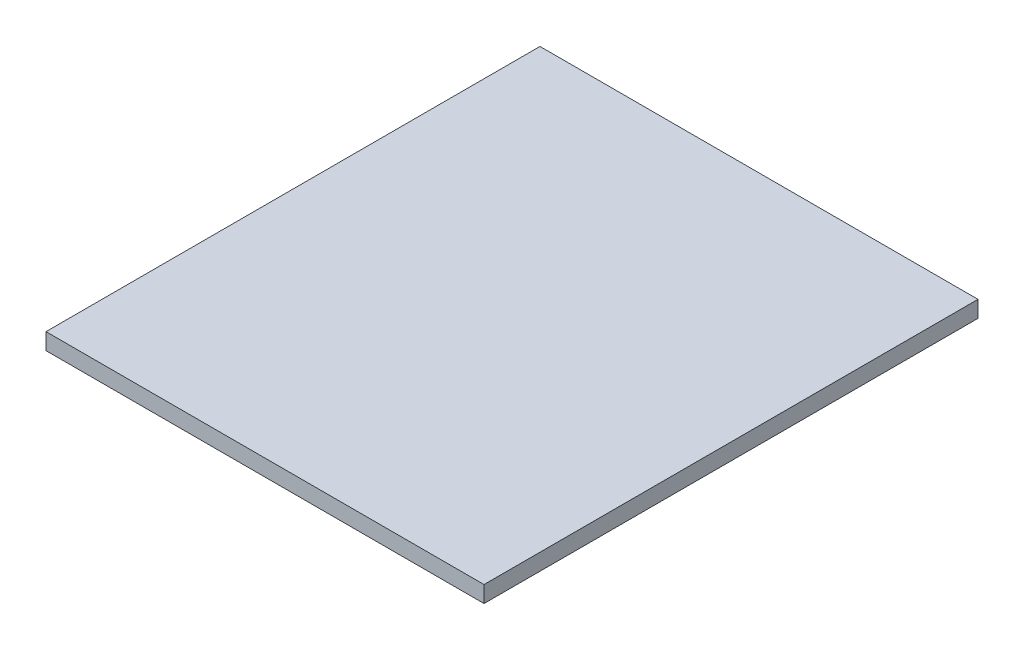
ISO-10303-21;
HEADER;
FILE_DESCRIPTION(('STEP AP214'),'2;1');
FILE_NAME('part.step','',(''),(''),'','','');
FILE_SCHEMA(('AUTOMOTIVE_DESIGN { 1 0 10303 214 1 1 1 1 }'));
ENDSEC;
DATA;
#1=APPLICATION_CONTEXT('core data for automotive mechanical design processes');
#2=APPLICATION_PROTOCOL_DEFINITION('international standard','automotive_design',2000,#1);
#3=PRODUCT_CONTEXT('',#1,'mechanical');
#4=PRODUCT('Part','Part','',(#3));
#5=PRODUCT_RELATED_PRODUCT_CATEGORY('part','',(#4));
#6=PRODUCT_DEFINITION_FORMATION('','',#4);
#7=PRODUCT_DEFINITION_CONTEXT('part definition',#1,'design');
#8=PRODUCT_DEFINITION('design','',#6,#7);
#9=PRODUCT_DEFINITION_SHAPE('','',#8);
#10=(LENGTH_UNIT() NAMED_UNIT(*) SI_UNIT(.MILLI.,.METRE.));
#11=(NAMED_UNIT(*) PLANE_ANGLE_UNIT() SI_UNIT($,.RADIAN.));
#12=(NAMED_UNIT(*) SI_UNIT($,.STERADIAN.) SOLID_ANGLE_UNIT());
#13=UNCERTAINTY_MEASURE_WITH_UNIT(LENGTH_MEASURE(1.E-05),#10,'distance_accuracy_value','');
#14=(GEOMETRIC_REPRESENTATION_CONTEXT(3) GLOBAL_UNCERTAINTY_ASSIGNED_CONTEXT((#13)) GLOBAL_UNIT_ASSIGNED_CONTEXT((#10,
#11,#12)) REPRESENTATION_CONTEXT('',''));
#15=CARTESIAN_POINT('',(0.,0.,0.));
#16=DIRECTION('',(0.,0.,1.));
#17=DIRECTION('',(1.,0.,0.));
#18=AXIS2_PLACEMENT_3D('',#15,#16,#17);
#19=CARTESIAN_POINT('',(-32.7919519710409,-2.80601026846749,-18.8397303234904));
#20=DIRECTION('',(-1.,0.,0.));
#21=DIRECTION('',(0.,0.,1.));
#22=AXIS2_PLACEMENT_3D('',#19,#20,#21);
#23=PLANE('',#22);
#24=DIRECTION('',(0.,1.,0.));
#25=VECTOR('',#24,1.);
#26=CARTESIAN_POINT('',(-32.7919519710409,-2.80601026846749,82.9682858626128));
#27=LINE('',#26,#25);
#28=CARTESIAN_POINT('',(-32.7919519710409,-2.80601026846749,82.9682858626128));
#29=VERTEX_POINT('',#28);
#30=CARTESIAN_POINT('',(-32.7919519710409,0.591745503008931,82.9682858626128));
#31=VERTEX_POINT('',#30);
#32=EDGE_CURVE('E40',#29,#31,#27,.T.);
#33=ORIENTED_EDGE('',*,*,#32,.T.);
#34=DIRECTION('',(0.,0.,1.));
#35=VECTOR('',#34,1.);
#36=CARTESIAN_POINT('',(-32.7919519710409,0.591745503008931,-18.8397303234904));
#37=LINE('',#36,#35);
#38=CARTESIAN_POINT('',(-32.7919519710409,0.591745503008931,-18.8397303234904));
#39=VERTEX_POINT('',#38);
#40=EDGE_CURVE('E77',#39,#31,#37,.T.);
#41=ORIENTED_EDGE('',*,*,#40,.F.);
#42=DIRECTION('',(0.,1.,0.));
#43=VECTOR('',#42,1.);
#44=CARTESIAN_POINT('',(-32.7919519710409,-2.80601026846749,-18.8397303234904));
#45=LINE('',#44,#43);
#46=CARTESIAN_POINT('',(-32.7919519710409,-2.80601026846749,-18.8397303234904));
#47=VERTEX_POINT('',#46);
#48=EDGE_CURVE('E11',#47,#39,#45,.T.);
#49=ORIENTED_EDGE('',*,*,#48,.F.);
#50=DIRECTION('',(0.,0.,1.));
#51=VECTOR('',#50,1.);
#52=CARTESIAN_POINT('',(-32.7919519710409,-2.80601026846749,-18.8397303234904));
#53=LINE('',#52,#51);
#54=EDGE_CURVE('E78',#47,#29,#53,.T.);
#55=ORIENTED_EDGE('',*,*,#54,.T.);
#56=EDGE_LOOP('',(#33,#41,#49,#55));
#57=FACE_BOUND('',#56,.T.);
#58=ADVANCED_FACE('F37',(#57),#23,.T.);
#59=CARTESIAN_POINT('',(-32.7919519710409,-2.80601026846749,-18.8397303234904));
#60=DIRECTION('',(0.,0.,-1.));
#61=DIRECTION('',(-1.,0.,0.));
#62=AXIS2_PLACEMENT_3D('',#59,#60,#61);
#63=PLANE('',#62);
#64=ORIENTED_EDGE('',*,*,#48,.T.);
#65=DIRECTION('',(-1.,0.,0.));
#66=VECTOR('',#65,1.);
#67=CARTESIAN_POINT('',(-32.7919519710409,0.591745503008931,-18.8397303234904));
#68=LINE('',#67,#66);
#69=CARTESIAN_POINT('',(57.4859173132641,0.591745503008931,-18.8397303234904));
#70=VERTEX_POINT('',#69);
#71=EDGE_CURVE('E94',#70,#39,#68,.T.);
#72=ORIENTED_EDGE('',*,*,#71,.F.);
#73=DIRECTION('',(0.,1.,0.));
#74=VECTOR('',#73,1.);
#75=CARTESIAN_POINT('',(57.4859173132641,-2.80601026846749,-18.8397303234904));
#76=LINE('',#75,#74);
#77=CARTESIAN_POINT('',(57.4859173132641,-2.80601026846749,-18.8397303234904));
#78=VERTEX_POINT('',#77);
#79=EDGE_CURVE('E45',#78,#70,#76,.T.);
#80=ORIENTED_EDGE('',*,*,#79,.F.);
#81=DIRECTION('',(-1.,0.,0.));
#82=VECTOR('',#81,1.);
#83=CARTESIAN_POINT('',(-32.7919519710409,-2.80601026846749,-18.8397303234904));
#84=LINE('',#83,#82);
#85=EDGE_CURVE('E83',#78,#47,#84,.T.);
#86=ORIENTED_EDGE('',*,*,#85,.T.);
#87=EDGE_LOOP('',(#64,#72,#80,#86));
#88=FACE_BOUND('',#87,.T.);
#89=ADVANCED_FACE('F109',(#88),#63,.T.);
#90=CARTESIAN_POINT('',(57.4859173132641,-2.80601026846749,-18.8397303234904));
#91=DIRECTION('',(1.,0.,0.));
#92=DIRECTION('',(0.,0.,-1.));
#93=AXIS2_PLACEMENT_3D('',#90,#91,#92);
#94=PLANE('',#93);
#95=ORIENTED_EDGE('',*,*,#79,.T.);
#96=DIRECTION('',(0.,0.,-1.));
#97=VECTOR('',#96,1.);
#98=CARTESIAN_POINT('',(57.4859173132641,0.591745503008931,-18.8397303234904));
#99=LINE('',#98,#97);
#100=CARTESIAN_POINT('',(57.4859173132641,0.591745503008931,82.9682858626128));
#101=VERTEX_POINT('',#100);
#102=EDGE_CURVE('E90',#101,#70,#99,.T.);
#103=ORIENTED_EDGE('',*,*,#102,.F.);
#104=DIRECTION('',(0.,1.,0.));
#105=VECTOR('',#104,1.);
#106=CARTESIAN_POINT('',(57.4859173132641,-2.80601026846749,82.9682858626128));
#107=LINE('',#106,#105);
#108=CARTESIAN_POINT('',(57.4859173132641,-2.80601026846749,82.9682858626128));
#109=VERTEX_POINT('',#108);
#110=EDGE_CURVE('E82',#109,#101,#107,.T.);
#111=ORIENTED_EDGE('',*,*,#110,.F.);
#112=DIRECTION('',(0.,0.,-1.));
#113=VECTOR('',#112,1.);
#114=CARTESIAN_POINT('',(57.4859173132641,-2.80601026846749,-18.8397303234904));
#115=LINE('',#114,#113);
#116=EDGE_CURVE('E102',#109,#78,#115,.T.);
#117=ORIENTED_EDGE('',*,*,#116,.T.);
#118=EDGE_LOOP('',(#95,#103,#111,#117));
#119=FACE_BOUND('',#118,.T.);
#120=ADVANCED_FACE('F106',(#119),#94,.T.);
#121=CARTESIAN_POINT('',(-32.7919519710409,-2.80601026846749,82.9682858626128));
#122=DIRECTION('',(0.,0.,1.));
#123=DIRECTION('',(1.,0.,0.));
#124=AXIS2_PLACEMENT_3D('',#121,#122,#123);
#125=PLANE('',#124);
#126=ORIENTED_EDGE('',*,*,#110,.T.);
#127=DIRECTION('',(1.,0.,0.));
#128=VECTOR('',#127,1.);
#129=CARTESIAN_POINT('',(-32.7919519710409,0.591745503008931,82.9682858626128));
#130=LINE('',#129,#128);
#131=EDGE_CURVE('E85',#31,#101,#130,.T.);
#132=ORIENTED_EDGE('',*,*,#131,.F.);
#133=ORIENTED_EDGE('',*,*,#32,.F.);
#134=DIRECTION('',(1.,0.,0.));
#135=VECTOR('',#134,1.);
#136=CARTESIAN_POINT('',(-32.7919519710409,-2.80601026846749,82.9682858626128));
#137=LINE('',#136,#135);
#138=EDGE_CURVE('E100',#29,#109,#137,.T.);
#139=ORIENTED_EDGE('',*,*,#138,.T.);
#140=EDGE_LOOP('',(#126,#132,#133,#139));
#141=FACE_BOUND('',#140,.T.);
#142=ADVANCED_FACE('F86',(#141),#125,.T.);
#143=CARTESIAN_POINT('',(0.,-2.80601026846749,0.));
#144=DIRECTION('',(0.,1.,0.));
#145=DIRECTION('',(0.,0.,1.));
#146=AXIS2_PLACEMENT_3D('',#143,#144,#145);
#147=PLANE('',#146);
#148=ORIENTED_EDGE('',*,*,#54,.F.);
#149=ORIENTED_EDGE('',*,*,#85,.F.);
#150=ORIENTED_EDGE('',*,*,#116,.F.);
#151=ORIENTED_EDGE('',*,*,#138,.F.);
#152=EDGE_LOOP('',(#148,#149,#150,#151));
#153=FACE_BOUND('',#152,.T.);
#154=ADVANCED_FACE('F111',(#153),#147,.F.);
#155=CARTESIAN_POINT('',(0.,0.591745503008931,0.));
#156=DIRECTION('',(0.,1.,0.));
#157=DIRECTION('',(0.,0.,1.));
#158=AXIS2_PLACEMENT_3D('',#155,#156,#157);
#159=PLANE('',#158);
#160=ORIENTED_EDGE('',*,*,#40,.T.);
#161=ORIENTED_EDGE('',*,*,#131,.T.);
#162=ORIENTED_EDGE('',*,*,#102,.T.);
#163=ORIENTED_EDGE('',*,*,#71,.T.);
#164=EDGE_LOOP('',(#160,#161,#162,#163));
#165=FACE_BOUND('',#164,.T.);
#166=ADVANCED_FACE('F93',(#165),#159,.T.);
#167=CLOSED_SHELL('',(#58,#89,#120,#142,#154,#166));
#168=MANIFOLD_SOLID_BREP('B2',#167);
#169=ADVANCED_BREP_SHAPE_REPRESENTATION('',(#18,#168),#14);
#170=SHAPE_DEFINITION_REPRESENTATION(#9,#169);
ENDSEC;
END-ISO-10303-21;
